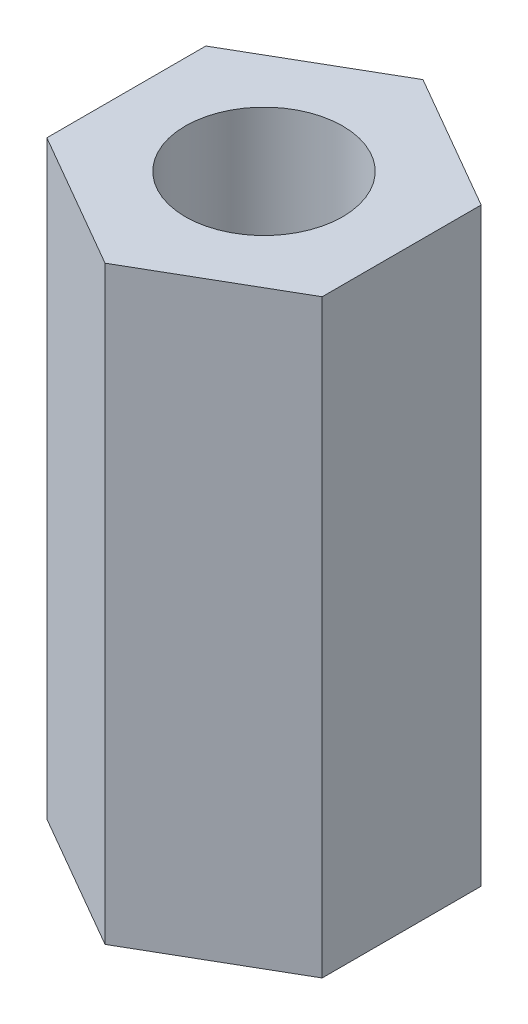
ISO-10303-21;
HEADER;
FILE_DESCRIPTION(('STEP AP214'),'2;1');
FILE_NAME('part.step','',(''),(''),'','','');
FILE_SCHEMA(('AUTOMOTIVE_DESIGN { 1 0 10303 214 1 1 1 1 }'));
ENDSEC;
DATA;
#1=APPLICATION_CONTEXT('core data for automotive mechanical design processes');
#2=APPLICATION_PROTOCOL_DEFINITION('international standard','automotive_design',2000,#1);
#3=PRODUCT_CONTEXT('',#1,'mechanical');
#4=PRODUCT('Part','Part','',(#3));
#5=PRODUCT_RELATED_PRODUCT_CATEGORY('part','',(#4));
#6=PRODUCT_DEFINITION_FORMATION('','',#4);
#7=PRODUCT_DEFINITION_CONTEXT('part definition',#1,'design');
#8=PRODUCT_DEFINITION('design','',#6,#7);
#9=PRODUCT_DEFINITION_SHAPE('','',#8);
#10=(LENGTH_UNIT() NAMED_UNIT(*) SI_UNIT(.MILLI.,.METRE.));
#11=(NAMED_UNIT(*) PLANE_ANGLE_UNIT() SI_UNIT($,.RADIAN.));
#12=(NAMED_UNIT(*) SI_UNIT($,.STERADIAN.) SOLID_ANGLE_UNIT());
#13=UNCERTAINTY_MEASURE_WITH_UNIT(LENGTH_MEASURE(1.E-05),#10,'distance_accuracy_value','');
#14=(GEOMETRIC_REPRESENTATION_CONTEXT(3) GLOBAL_UNCERTAINTY_ASSIGNED_CONTEXT((#13)) GLOBAL_UNIT_ASSIGNED_CONTEXT((#10,
#11,#12)) REPRESENTATION_CONTEXT('',''));
#15=CARTESIAN_POINT('',(0.,0.,0.));
#16=DIRECTION('',(0.,0.,1.));
#17=DIRECTION('',(1.,0.,0.));
#18=AXIS2_PLACEMENT_3D('',#15,#16,#17);
#19=CARTESIAN_POINT('',(0.,15.,0.));
#20=DIRECTION('',(0.,1.,0.));
#21=DIRECTION('',(0.,0.,1.));
#22=AXIS2_PLACEMENT_3D('',#19,#20,#21);
#23=PLANE('',#22);
#24=DIRECTION('',(0.,0.,-1.));
#25=VECTOR('',#24,1.);
#26=CARTESIAN_POINT('',(3.5,15.,2.02072594216369));
#27=LINE('',#26,#25);
#28=CARTESIAN_POINT('',(3.5,15.,2.02072594216369));
#29=VERTEX_POINT('',#28);
#30=CARTESIAN_POINT('',(3.5,15.,-2.02072594216369));
#31=VERTEX_POINT('',#30);
#32=EDGE_CURVE('E139',#29,#31,#27,.T.);
#33=ORIENTED_EDGE('',*,*,#32,.T.);
#34=DIRECTION('',(-0.866025403784438,0.,-0.5));
#35=VECTOR('',#34,1.);
#36=CARTESIAN_POINT('',(3.5,15.,-2.02072594216369));
#37=LINE('',#36,#35);
#38=CARTESIAN_POINT('',(0.,15.,-4.04145188432738));
#39=VERTEX_POINT('',#38);
#40=EDGE_CURVE('E97',#31,#39,#37,.T.);
#41=ORIENTED_EDGE('',*,*,#40,.T.);
#42=DIRECTION('',(-0.866025403784439,0.,0.5));
#43=VECTOR('',#42,1.);
#44=CARTESIAN_POINT('',(0.,15.,-4.04145188432738));
#45=LINE('',#44,#43);
#46=CARTESIAN_POINT('',(-3.5,15.,-2.02072594216369));
#47=VERTEX_POINT('',#46);
#48=EDGE_CURVE('E110',#39,#47,#45,.T.);
#49=ORIENTED_EDGE('',*,*,#48,.T.);
#50=DIRECTION('',(0.,0.,1.));
#51=VECTOR('',#50,1.);
#52=CARTESIAN_POINT('',(-3.5,15.,-2.02072594216369));
#53=LINE('',#52,#51);
#54=CARTESIAN_POINT('',(-3.5,15.,2.02072594216369));
#55=VERTEX_POINT('',#54);
#56=EDGE_CURVE('E104',#47,#55,#53,.T.);
#57=ORIENTED_EDGE('',*,*,#56,.T.);
#58=DIRECTION('',(0.866025403784439,0.,0.5));
#59=VECTOR('',#58,1.);
#60=CARTESIAN_POINT('',(-3.5,15.,2.02072594216369));
#61=LINE('',#60,#59);
#62=CARTESIAN_POINT('',(0.,15.,4.04145188432738));
#63=VERTEX_POINT('',#62);
#64=EDGE_CURVE('E108',#55,#63,#61,.T.);
#65=ORIENTED_EDGE('',*,*,#64,.T.);
#66=DIRECTION('',(0.866025403784439,0.,-0.5));
#67=VECTOR('',#66,1.);
#68=CARTESIAN_POINT('',(0.,15.,4.04145188432738));
#69=LINE('',#68,#67);
#70=EDGE_CURVE('E60',#63,#29,#69,.T.);
#71=ORIENTED_EDGE('',*,*,#70,.T.);
#72=EDGE_LOOP('',(#33,#41,#49,#57,#65,#71));
#73=FACE_BOUND('',#72,.T.);
#74=CARTESIAN_POINT('',(0.,15.,0.));
#75=DIRECTION('',(0.,1.,0.));
#76=DIRECTION('',(0.,0.,1.));
#77=AXIS2_PLACEMENT_3D('',#74,#75,#76);
#78=CIRCLE('',#77,2.);
#79=CARTESIAN_POINT('',(0.,15.,2.));
#80=VERTEX_POINT('',#79);
#81=EDGE_CURVE('E132',#80,#80,#78,.T.);
#82=ORIENTED_EDGE('',*,*,#81,.F.);
#83=EDGE_LOOP('',(#82));
#84=FACE_BOUND('',#83,.T.);
#85=ADVANCED_FACE('F43',(#73,#84),#23,.T.);
#86=CARTESIAN_POINT('',(0.,0.,0.));
#87=DIRECTION('',(0.,1.,0.));
#88=DIRECTION('',(0.,0.,1.));
#89=AXIS2_PLACEMENT_3D('',#86,#87,#88);
#90=PLANE('',#89);
#91=DIRECTION('',(0.,0.,-1.));
#92=VECTOR('',#91,1.);
#93=CARTESIAN_POINT('',(3.5,0.,2.02072594216369));
#94=LINE('',#93,#92);
#95=CARTESIAN_POINT('',(3.5,0.,2.02072594216369));
#96=VERTEX_POINT('',#95);
#97=CARTESIAN_POINT('',(3.5,0.,-2.02072594216369));
#98=VERTEX_POINT('',#97);
#99=EDGE_CURVE('E128',#96,#98,#94,.T.);
#100=ORIENTED_EDGE('',*,*,#99,.F.);
#101=DIRECTION('',(0.866025403784439,0.,-0.5));
#102=VECTOR('',#101,1.);
#103=CARTESIAN_POINT('',(0.,0.,4.04145188432738));
#104=LINE('',#103,#102);
#105=CARTESIAN_POINT('',(0.,0.,4.04145188432738));
#106=VERTEX_POINT('',#105);
#107=EDGE_CURVE('E89',#106,#96,#104,.T.);
#108=ORIENTED_EDGE('',*,*,#107,.F.);
#109=DIRECTION('',(0.866025403784439,0.,0.5));
#110=VECTOR('',#109,1.);
#111=CARTESIAN_POINT('',(-3.5,0.,2.02072594216369));
#112=LINE('',#111,#110);
#113=CARTESIAN_POINT('',(-3.5,0.,2.02072594216369));
#114=VERTEX_POINT('',#113);
#115=EDGE_CURVE('E83',#114,#106,#112,.T.);
#116=ORIENTED_EDGE('',*,*,#115,.F.);
#117=DIRECTION('',(0.,0.,1.));
#118=VECTOR('',#117,1.);
#119=CARTESIAN_POINT('',(-3.5,0.,-2.02072594216369));
#120=LINE('',#119,#118);
#121=CARTESIAN_POINT('',(-3.5,0.,-2.02072594216369));
#122=VERTEX_POINT('',#121);
#123=EDGE_CURVE('E118',#122,#114,#120,.T.);
#124=ORIENTED_EDGE('',*,*,#123,.F.);
#125=DIRECTION('',(-0.866025403784439,0.,0.5));
#126=VECTOR('',#125,1.);
#127=CARTESIAN_POINT('',(0.,0.,-4.04145188432738));
#128=LINE('',#127,#126);
#129=CARTESIAN_POINT('',(0.,0.,-4.04145188432738));
#130=VERTEX_POINT('',#129);
#131=EDGE_CURVE('E134',#130,#122,#128,.T.);
#132=ORIENTED_EDGE('',*,*,#131,.F.);
#133=DIRECTION('',(-0.866025403784438,0.,-0.5));
#134=VECTOR('',#133,1.);
#135=CARTESIAN_POINT('',(3.5,0.,-2.02072594216369));
#136=LINE('',#135,#134);
#137=EDGE_CURVE('E131',#98,#130,#136,.T.);
#138=ORIENTED_EDGE('',*,*,#137,.F.);
#139=EDGE_LOOP('',(#100,#108,#116,#124,#132,#138));
#140=FACE_BOUND('',#139,.T.);
#141=CARTESIAN_POINT('',(0.,0.,0.));
#142=DIRECTION('',(0.,1.,0.));
#143=DIRECTION('',(0.,0.,1.));
#144=AXIS2_PLACEMENT_3D('',#141,#142,#143);
#145=CIRCLE('',#144,2.);
#146=CARTESIAN_POINT('',(0.,0.,2.));
#147=VERTEX_POINT('',#146);
#148=EDGE_CURVE('E250',#147,#147,#145,.T.);
#149=ORIENTED_EDGE('',*,*,#148,.T.);
#150=EDGE_LOOP('',(#149));
#151=FACE_BOUND('',#150,.T.);
#152=ADVANCED_FACE('F148',(#140,#151),#90,.F.);
#153=CARTESIAN_POINT('',(3.5,15.,2.02072594216369));
#154=DIRECTION('',(-1.,0.,0.));
#155=DIRECTION('',(0.,0.,1.));
#156=AXIS2_PLACEMENT_3D('',#153,#154,#155);
#157=PLANE('',#156);
#158=ORIENTED_EDGE('',*,*,#99,.T.);
#159=DIRECTION('',(0.,-1.,0.));
#160=VECTOR('',#159,1.);
#161=CARTESIAN_POINT('',(3.5,15.,-2.02072594216369));
#162=LINE('',#161,#160);
#163=EDGE_CURVE('E11',#31,#98,#162,.T.);
#164=ORIENTED_EDGE('',*,*,#163,.F.);
#165=ORIENTED_EDGE('',*,*,#32,.F.);
#166=DIRECTION('',(0.,-1.,0.));
#167=VECTOR('',#166,1.);
#168=CARTESIAN_POINT('',(3.5,15.,2.02072594216369));
#169=LINE('',#168,#167);
#170=EDGE_CURVE('E124',#29,#96,#169,.T.);
#171=ORIENTED_EDGE('',*,*,#170,.T.);
#172=EDGE_LOOP('',(#158,#164,#165,#171));
#173=FACE_BOUND('',#172,.T.);
#174=ADVANCED_FACE('F45',(#173),#157,.F.);
#175=CARTESIAN_POINT('',(3.5,15.,-2.02072594216369));
#176=DIRECTION('',(-0.5,0.,0.866025403784438));
#177=DIRECTION('',(0.866025403784439,0.,0.5));
#178=AXIS2_PLACEMENT_3D('',#175,#176,#177);
#179=PLANE('',#178);
#180=ORIENTED_EDGE('',*,*,#137,.T.);
#181=DIRECTION('',(0.,-1.,0.));
#182=VECTOR('',#181,1.);
#183=CARTESIAN_POINT('',(0.,15.,-4.04145188432738));
#184=LINE('',#183,#182);
#185=EDGE_CURVE('E52',#39,#130,#184,.T.);
#186=ORIENTED_EDGE('',*,*,#185,.F.);
#187=ORIENTED_EDGE('',*,*,#40,.F.);
#188=ORIENTED_EDGE('',*,*,#163,.T.);
#189=EDGE_LOOP('',(#180,#186,#187,#188));
#190=FACE_BOUND('',#189,.T.);
#191=ADVANCED_FACE('F173',(#190),#179,.F.);
#192=CARTESIAN_POINT('',(0.,15.,-4.04145188432738));
#193=DIRECTION('',(0.5,0.,0.866025403784439));
#194=DIRECTION('',(0.866025403784439,0.,-0.5));
#195=AXIS2_PLACEMENT_3D('',#192,#193,#194);
#196=PLANE('',#195);
#197=ORIENTED_EDGE('',*,*,#131,.T.);
#198=DIRECTION('',(0.,-1.,0.));
#199=VECTOR('',#198,1.);
#200=CARTESIAN_POINT('',(-3.5,15.,-2.02072594216369));
#201=LINE('',#200,#199);
#202=EDGE_CURVE('E119',#47,#122,#201,.T.);
#203=ORIENTED_EDGE('',*,*,#202,.F.);
#204=ORIENTED_EDGE('',*,*,#48,.F.);
#205=ORIENTED_EDGE('',*,*,#185,.T.);
#206=EDGE_LOOP('',(#197,#203,#204,#205));
#207=FACE_BOUND('',#206,.T.);
#208=ADVANCED_FACE('F145',(#207),#196,.F.);
#209=CARTESIAN_POINT('',(-3.5,15.,-2.02072594216369));
#210=DIRECTION('',(1.,0.,0.));
#211=DIRECTION('',(0.,0.,-1.));
#212=AXIS2_PLACEMENT_3D('',#209,#210,#211);
#213=PLANE('',#212);
#214=ORIENTED_EDGE('',*,*,#123,.T.);
#215=DIRECTION('',(0.,-1.,0.));
#216=VECTOR('',#215,1.);
#217=CARTESIAN_POINT('',(-3.5,15.,2.02072594216369));
#218=LINE('',#217,#216);
#219=EDGE_CURVE('E115',#55,#114,#218,.T.);
#220=ORIENTED_EDGE('',*,*,#219,.F.);
#221=ORIENTED_EDGE('',*,*,#56,.F.);
#222=ORIENTED_EDGE('',*,*,#202,.T.);
#223=EDGE_LOOP('',(#214,#220,#221,#222));
#224=FACE_BOUND('',#223,.T.);
#225=ADVANCED_FACE('F116',(#224),#213,.F.);
#226=CARTESIAN_POINT('',(-3.5,15.,2.02072594216369));
#227=DIRECTION('',(0.5,0.,-0.866025403784438));
#228=DIRECTION('',(-0.866025403784439,0.,-0.5));
#229=AXIS2_PLACEMENT_3D('',#226,#227,#228);
#230=PLANE('',#229);
#231=ORIENTED_EDGE('',*,*,#115,.T.);
#232=DIRECTION('',(0.,-1.,0.));
#233=VECTOR('',#232,1.);
#234=CARTESIAN_POINT('',(0.,15.,4.04145188432738));
#235=LINE('',#234,#233);
#236=EDGE_CURVE('E120',#63,#106,#235,.T.);
#237=ORIENTED_EDGE('',*,*,#236,.F.);
#238=ORIENTED_EDGE('',*,*,#64,.F.);
#239=ORIENTED_EDGE('',*,*,#219,.T.);
#240=EDGE_LOOP('',(#231,#237,#238,#239));
#241=FACE_BOUND('',#240,.T.);
#242=ADVANCED_FACE('F122',(#241),#230,.F.);
#243=CARTESIAN_POINT('',(0.,15.,4.04145188432738));
#244=DIRECTION('',(-0.5,0.,-0.866025403784439));
#245=DIRECTION('',(-0.866025403784439,0.,0.5));
#246=AXIS2_PLACEMENT_3D('',#243,#244,#245);
#247=PLANE('',#246);
#248=ORIENTED_EDGE('',*,*,#107,.T.);
#249=ORIENTED_EDGE('',*,*,#170,.F.);
#250=ORIENTED_EDGE('',*,*,#70,.F.);
#251=ORIENTED_EDGE('',*,*,#236,.T.);
#252=EDGE_LOOP('',(#248,#249,#250,#251));
#253=FACE_BOUND('',#252,.T.);
#254=ADVANCED_FACE('F153',(#253),#247,.F.);
#255=CARTESIAN_POINT('',(0.,15.,0.));
#256=DIRECTION('',(0.,-1.,0.));
#257=DIRECTION('',(0.,0.,-1.));
#258=AXIS2_PLACEMENT_3D('',#255,#256,#257);
#259=CYLINDRICAL_SURFACE('',#258,2.);
#260=ORIENTED_EDGE('',*,*,#81,.T.);
#261=EDGE_LOOP('',(#260));
#262=FACE_BOUND('',#261,.T.);
#263=ORIENTED_EDGE('',*,*,#148,.F.);
#264=EDGE_LOOP('',(#263));
#265=FACE_BOUND('',#264,.T.);
#266=ADVANCED_FACE('F155',(#262,#265),#259,.F.);
#267=CLOSED_SHELL('',(#85,#152,#174,#191,#208,#225,#242,#254,#266));
#268=MANIFOLD_SOLID_BREP('B2',#267);
#269=ADVANCED_BREP_SHAPE_REPRESENTATION('',(#18,#268),#14);
#270=SHAPE_DEFINITION_REPRESENTATION(#9,#269);
ENDSEC;
END-ISO-10303-21;
